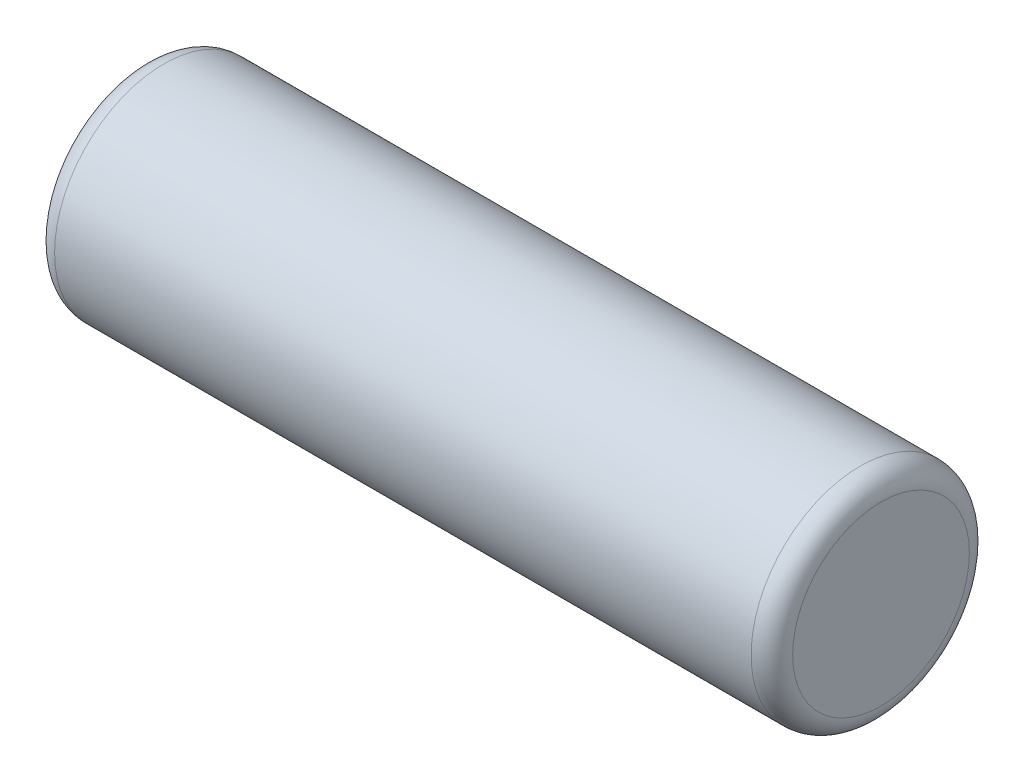
ISO-10303-21;
HEADER;
FILE_DESCRIPTION(('STEP AP214'),'2;1');
FILE_NAME('part.step','',(''),(''),'','','');
FILE_SCHEMA(('AUTOMOTIVE_DESIGN { 1 0 10303 214 1 1 1 1 }'));
ENDSEC;
DATA;
#1=APPLICATION_CONTEXT('core data for automotive mechanical design processes');
#2=APPLICATION_PROTOCOL_DEFINITION('international standard','automotive_design',2000,#1);
#3=PRODUCT_CONTEXT('',#1,'mechanical');
#4=PRODUCT('Part','Part','',(#3));
#5=PRODUCT_RELATED_PRODUCT_CATEGORY('part','',(#4));
#6=PRODUCT_DEFINITION_FORMATION('','',#4);
#7=PRODUCT_DEFINITION_CONTEXT('part definition',#1,'design');
#8=PRODUCT_DEFINITION('design','',#6,#7);
#9=PRODUCT_DEFINITION_SHAPE('','',#8);
#10=(LENGTH_UNIT() NAMED_UNIT(*) SI_UNIT(.MILLI.,.METRE.));
#11=(NAMED_UNIT(*) PLANE_ANGLE_UNIT() SI_UNIT($,.RADIAN.));
#12=(NAMED_UNIT(*) SI_UNIT($,.STERADIAN.) SOLID_ANGLE_UNIT());
#13=UNCERTAINTY_MEASURE_WITH_UNIT(LENGTH_MEASURE(1.E-05),#10,'distance_accuracy_value','');
#14=(GEOMETRIC_REPRESENTATION_CONTEXT(3) GLOBAL_UNCERTAINTY_ASSIGNED_CONTEXT((#13)) GLOBAL_UNIT_ASSIGNED_CONTEXT((#10,
#11,#12)) REPRESENTATION_CONTEXT('',''));
#15=CARTESIAN_POINT('',(0.,0.,0.));
#16=DIRECTION('',(0.,0.,1.));
#17=DIRECTION('',(1.,0.,0.));
#18=AXIS2_PLACEMENT_3D('',#15,#16,#17);
#19=CARTESIAN_POINT('',(-35.5,0.,0.));
#20=DIRECTION('',(-1.,0.,0.));
#21=DIRECTION('',(0.,0.,1.));
#22=AXIS2_PLACEMENT_3D('',#19,#20,#21);
#23=PLANE('',#22);
#24=CARTESIAN_POINT('',(-35.5,0.,0.));
#25=DIRECTION('',(-1.,0.,0.));
#26=DIRECTION('',(0.,0.,1.));
#27=AXIS2_PLACEMENT_3D('',#24,#25,#26);
#28=CIRCLE('',#27,2.5);
#29=CARTESIAN_POINT('',(-35.5,0.,2.50000000000001));
#30=VERTEX_POINT('',#29);
#31=EDGE_CURVE('E63',#30,#30,#28,.T.);
#32=ORIENTED_EDGE('',*,*,#31,.F.);
#33=EDGE_LOOP('',(#32));
#34=FACE_BOUND('',#33,.T.);
#35=CARTESIAN_POINT('',(-35.5,0.,0.));
#36=DIRECTION('',(-1.,0.,0.));
#37=DIRECTION('',(0.,0.,1.));
#38=AXIS2_PLACEMENT_3D('',#35,#36,#37);
#39=CIRCLE('',#38,8.5);
#40=CARTESIAN_POINT('',(-35.5,0.,8.50000000000001));
#41=VERTEX_POINT('',#40);
#42=EDGE_CURVE('E57',#41,#41,#39,.T.);
#43=ORIENTED_EDGE('',*,*,#42,.T.);
#44=EDGE_LOOP('',(#43));
#45=FACE_BOUND('',#44,.T.);
#46=ADVANCED_FACE('F37',(#34,#45),#23,.T.);
#47=CARTESIAN_POINT('',(35.5,0.,0.));
#48=DIRECTION('',(1.,0.,0.));
#49=DIRECTION('',(0.,0.,-1.));
#50=AXIS2_PLACEMENT_3D('',#47,#48,#49);
#51=CYLINDRICAL_SURFACE('',#50,10.5);
#52=CARTESIAN_POINT('',(33.5,0.,0.));
#53=DIRECTION('',(1.,0.,0.));
#54=DIRECTION('',(0.,0.,-1.));
#55=AXIS2_PLACEMENT_3D('',#52,#53,#54);
#56=CIRCLE('',#55,10.5);
#57=CARTESIAN_POINT('',(33.5,0.,-10.5));
#58=VERTEX_POINT('',#57);
#59=EDGE_CURVE('E48',#58,#58,#56,.F.);
#60=ORIENTED_EDGE('',*,*,#59,.T.);
#61=EDGE_LOOP('',(#60));
#62=FACE_BOUND('',#61,.T.);
#63=CARTESIAN_POINT('',(-33.5,0.,0.));
#64=DIRECTION('',(-1.,0.,0.));
#65=DIRECTION('',(0.,0.,1.));
#66=AXIS2_PLACEMENT_3D('',#63,#64,#65);
#67=CIRCLE('',#66,10.5);
#68=CARTESIAN_POINT('',(-33.5,0.,10.5));
#69=VERTEX_POINT('',#68);
#70=EDGE_CURVE('E60',#69,#69,#67,.F.);
#71=ORIENTED_EDGE('',*,*,#70,.T.);
#72=EDGE_LOOP('',(#71));
#73=FACE_BOUND('',#72,.T.);
#74=ADVANCED_FACE('F71',(#62,#73),#51,.T.);
#75=CARTESIAN_POINT('',(35.5,0.,-10.5));
#76=DIRECTION('',(1.,0.,0.));
#77=DIRECTION('',(0.,0.,-1.));
#78=AXIS2_PLACEMENT_3D('',#75,#76,#77);
#79=PLANE('',#78);
#80=CARTESIAN_POINT('',(35.5,0.,0.));
#81=DIRECTION('',(1.,0.,0.));
#82=DIRECTION('',(0.,0.,-1.));
#83=AXIS2_PLACEMENT_3D('',#80,#81,#82);
#84=CIRCLE('',#83,8.5);
#85=CARTESIAN_POINT('',(35.5,0.,-8.50000000000002));
#86=VERTEX_POINT('',#85);
#87=EDGE_CURVE('E52',#86,#86,#84,.T.);
#88=ORIENTED_EDGE('',*,*,#87,.T.);
#89=EDGE_LOOP('',(#88));
#90=FACE_BOUND('',#89,.T.);
#91=ADVANCED_FACE('F79',(#90),#79,.T.);
#92=CARTESIAN_POINT('',(-33.5,0.,0.));
#93=DIRECTION('',(-1.,0.,0.));
#94=DIRECTION('',(0.,0.,1.));
#95=AXIS2_PLACEMENT_3D('',#92,#93,#94);
#96=TOROIDAL_SURFACE('',#95,8.5,2.);
#97=ORIENTED_EDGE('',*,*,#42,.F.);
#98=EDGE_LOOP('',(#97));
#99=FACE_BOUND('',#98,.T.);
#100=ORIENTED_EDGE('',*,*,#70,.F.);
#101=EDGE_LOOP('',(#100));
#102=FACE_BOUND('',#101,.T.);
#103=ADVANCED_FACE('F75',(#99,#102),#96,.T.);
#104=CARTESIAN_POINT('',(33.5,0.,0.));
#105=DIRECTION('',(1.,0.,0.));
#106=DIRECTION('',(0.,0.,-1.));
#107=AXIS2_PLACEMENT_3D('',#104,#105,#106);
#108=TOROIDAL_SURFACE('',#107,8.5,2.);
#109=ORIENTED_EDGE('',*,*,#59,.F.);
#110=EDGE_LOOP('',(#109));
#111=FACE_BOUND('',#110,.T.);
#112=ORIENTED_EDGE('',*,*,#87,.F.);
#113=EDGE_LOOP('',(#112));
#114=FACE_BOUND('',#113,.T.);
#115=ADVANCED_FACE('F78',(#111,#114),#108,.T.);
#116=CARTESIAN_POINT('',(-37.5,0.,0.));
#117=DIRECTION('',(1.,0.,0.));
#118=DIRECTION('',(0.,0.,-1.));
#119=AXIS2_PLACEMENT_3D('',#116,#117,#118);
#120=CYLINDRICAL_SURFACE('',#119,2.5);
#121=CARTESIAN_POINT('',(-36.5,0.,0.));
#122=DIRECTION('',(-1.,0.,0.));
#123=DIRECTION('',(0.,0.,1.));
#124=AXIS2_PLACEMENT_3D('',#121,#122,#123);
#125=CIRCLE('',#124,2.5);
#126=CARTESIAN_POINT('',(-36.5,0.,2.50000000000001));
#127=VERTEX_POINT('',#126);
#128=EDGE_CURVE('E10',#127,#127,#125,.F.);
#129=ORIENTED_EDGE('',*,*,#128,.T.);
#130=EDGE_LOOP('',(#129));
#131=FACE_BOUND('',#130,.T.);
#132=ORIENTED_EDGE('',*,*,#31,.T.);
#133=EDGE_LOOP('',(#132));
#134=FACE_BOUND('',#133,.T.);
#135=ADVANCED_FACE('F67',(#131,#134),#120,.T.);
#136=CARTESIAN_POINT('',(-37.5,0.,0.));
#137=DIRECTION('',(-1.,0.,0.));
#138=DIRECTION('',(0.,0.,1.));
#139=AXIS2_PLACEMENT_3D('',#136,#137,#138);
#140=PLANE('',#139);
#141=CARTESIAN_POINT('',(-37.5,0.,0.));
#142=DIRECTION('',(-1.,0.,0.));
#143=DIRECTION('',(0.,0.,1.));
#144=AXIS2_PLACEMENT_3D('',#141,#142,#143);
#145=CIRCLE('',#144,1.5);
#146=CARTESIAN_POINT('',(-37.5,0.,1.50000000000001));
#147=VERTEX_POINT('',#146);
#148=EDGE_CURVE('E44',#147,#147,#145,.T.);
#149=ORIENTED_EDGE('',*,*,#148,.T.);
#150=EDGE_LOOP('',(#149));
#151=FACE_BOUND('',#150,.T.);
#152=ADVANCED_FACE('F97',(#151),#140,.T.);
#153=CARTESIAN_POINT('',(-36.5,0.,0.));
#154=DIRECTION('',(-1.,0.,0.));
#155=DIRECTION('',(0.,0.,1.));
#156=AXIS2_PLACEMENT_3D('',#153,#154,#155);
#157=TOROIDAL_SURFACE('',#156,1.5,1.);
#158=ORIENTED_EDGE('',*,*,#128,.F.);
#159=EDGE_LOOP('',(#158));
#160=FACE_BOUND('',#159,.T.);
#161=ORIENTED_EDGE('',*,*,#148,.F.);
#162=EDGE_LOOP('',(#161));
#163=FACE_BOUND('',#162,.T.);
#164=ADVANCED_FACE('F39',(#160,#163),#157,.T.);
#165=CLOSED_SHELL('',(#46,#74,#91,#103,#115,#135,#152,#164));
#166=MANIFOLD_SOLID_BREP('B2',#165);
#167=ADVANCED_BREP_SHAPE_REPRESENTATION('',(#18,#166),#14);
#168=SHAPE_DEFINITION_REPRESENTATION(#9,#167);
ENDSEC;
END-ISO-10303-21;
